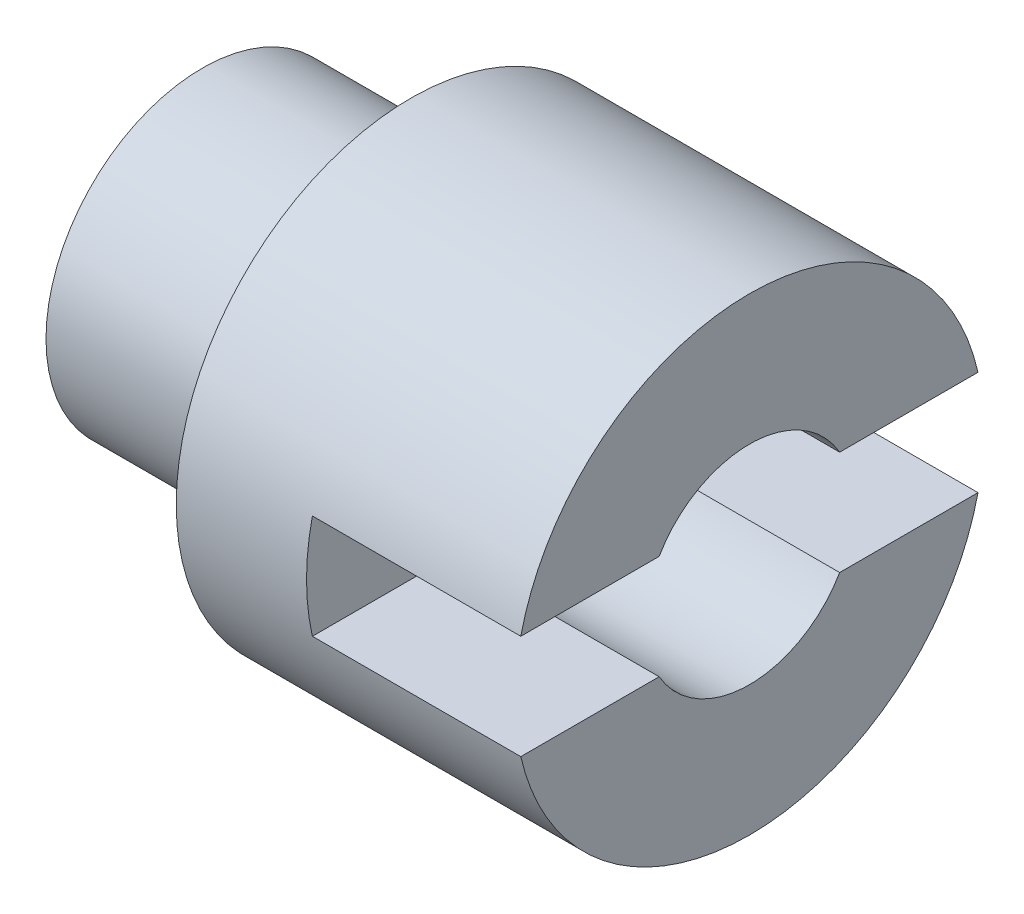
ISO-10303-21;
HEADER;
FILE_DESCRIPTION(('STEP AP214'),'2;1');
FILE_NAME('part.step','',(''),(''),'','','');
FILE_SCHEMA(('AUTOMOTIVE_DESIGN { 1 0 10303 214 1 1 1 1 }'));
ENDSEC;
DATA;
#1=APPLICATION_CONTEXT('core data for automotive mechanical design processes');
#2=APPLICATION_PROTOCOL_DEFINITION('international standard','automotive_design',2000,#1);
#3=PRODUCT_CONTEXT('',#1,'mechanical');
#4=PRODUCT('Part','Part','',(#3));
#5=PRODUCT_RELATED_PRODUCT_CATEGORY('part','',(#4));
#6=PRODUCT_DEFINITION_FORMATION('','',#4);
#7=PRODUCT_DEFINITION_CONTEXT('part definition',#1,'design');
#8=PRODUCT_DEFINITION('design','',#6,#7);
#9=PRODUCT_DEFINITION_SHAPE('','',#8);
#10=(LENGTH_UNIT() NAMED_UNIT(*) SI_UNIT(.MILLI.,.METRE.));
#11=(NAMED_UNIT(*) PLANE_ANGLE_UNIT() SI_UNIT($,.RADIAN.));
#12=(NAMED_UNIT(*) SI_UNIT($,.STERADIAN.) SOLID_ANGLE_UNIT());
#13=UNCERTAINTY_MEASURE_WITH_UNIT(LENGTH_MEASURE(1.E-05),#10,'distance_accuracy_value','');
#14=(GEOMETRIC_REPRESENTATION_CONTEXT(3) GLOBAL_UNCERTAINTY_ASSIGNED_CONTEXT((#13)) GLOBAL_UNIT_ASSIGNED_CONTEXT((#10,
#11,#12)) REPRESENTATION_CONTEXT('',''));
#15=CARTESIAN_POINT('',(0.,0.,0.));
#16=DIRECTION('',(0.,0.,1.));
#17=DIRECTION('',(1.,0.,0.));
#18=AXIS2_PLACEMENT_3D('',#15,#16,#17);
#19=CARTESIAN_POINT('',(0.,0.,0.));
#20=DIRECTION('',(-1.,0.,0.));
#21=DIRECTION('',(0.,0.,1.));
#22=AXIS2_PLACEMENT_3D('',#19,#20,#21);
#23=PLANE('',#22);
#24=CARTESIAN_POINT('',(0.,0.,0.));
#25=DIRECTION('',(-1.,0.,0.));
#26=DIRECTION('',(0.,0.,1.));
#27=AXIS2_PLACEMENT_3D('',#24,#25,#26);
#28=CIRCLE('',#27,0.98);
#29=CARTESIAN_POINT('',(0.,0.,0.98));
#30=VERTEX_POINT('',#29);
#31=EDGE_CURVE('E188',#30,#30,#28,.T.);
#32=ORIENTED_EDGE('',*,*,#31,.T.);
#33=EDGE_LOOP('',(#32));
#34=FACE_BOUND('',#33,.T.);
#35=DIRECTION('',(0.,0.,1.));
#36=VECTOR('',#35,1.);
#37=CARTESIAN_POINT('',(0.,1.,5.54444219318384));
#38=LINE('',#37,#36);
#39=CARTESIAN_POINT('',(0.,1.,1.73205080756888));
#40=VERTEX_POINT('',#39);
#41=CARTESIAN_POINT('',(0.,1.,4.38748219369606));
#42=VERTEX_POINT('',#41);
#43=EDGE_CURVE('E129',#40,#42,#38,.T.);
#44=ORIENTED_EDGE('',*,*,#43,.T.);
#45=CARTESIAN_POINT('',(0.,0.,0.));
#46=DIRECTION('',(-1.,0.,0.));
#47=DIRECTION('',(0.,0.,1.));
#48=AXIS2_PLACEMENT_3D('',#45,#46,#47);
#49=CIRCLE('',#48,4.5);
#50=CARTESIAN_POINT('',(0.,-1.,4.38748219369606));
#51=VERTEX_POINT('',#50);
#52=EDGE_CURVE('E134',#51,#42,#49,.T.);
#53=ORIENTED_EDGE('',*,*,#52,.F.);
#54=DIRECTION('',(0.,0.,-1.));
#55=VECTOR('',#54,1.);
#56=CARTESIAN_POINT('',(0.,-1.,5.54444219318384));
#57=LINE('',#56,#55);
#58=CARTESIAN_POINT('',(0.,-1.,1.73205080756888));
#59=VERTEX_POINT('',#58);
#60=EDGE_CURVE('E140',#51,#59,#57,.T.);
#61=ORIENTED_EDGE('',*,*,#60,.T.);
#62=CARTESIAN_POINT('',(0.,0.,0.));
#63=DIRECTION('',(1.,0.,0.));
#64=DIRECTION('',(0.,0.,-1.));
#65=AXIS2_PLACEMENT_3D('',#62,#63,#64);
#66=CIRCLE('',#65,2.);
#67=CARTESIAN_POINT('',(0.,-1.,-1.73205080756888));
#68=VERTEX_POINT('',#67);
#69=EDGE_CURVE('E149',#59,#68,#66,.T.);
#70=ORIENTED_EDGE('',*,*,#69,.T.);
#71=CARTESIAN_POINT('',(0.,-1.,-4.38748219369606));
#72=VERTEX_POINT('',#71);
#73=EDGE_CURVE('E137',#68,#72,#57,.T.);
#74=ORIENTED_EDGE('',*,*,#73,.T.);
#75=CARTESIAN_POINT('',(0.,1.,-4.38748219369606));
#76=VERTEX_POINT('',#75);
#77=EDGE_CURVE('E114',#76,#72,#49,.T.);
#78=ORIENTED_EDGE('',*,*,#77,.F.);
#79=CARTESIAN_POINT('',(0.,1.,-1.73205080756888));
#80=VERTEX_POINT('',#79);
#81=EDGE_CURVE('E55',#76,#80,#38,.T.);
#82=ORIENTED_EDGE('',*,*,#81,.T.);
#83=CARTESIAN_POINT('',(0.,0.,0.));
#84=DIRECTION('',(1.,0.,0.));
#85=DIRECTION('',(0.,0.,-1.));
#86=AXIS2_PLACEMENT_3D('',#83,#84,#85);
#87=CIRCLE('',#86,2.);
#88=EDGE_CURVE('E50',#80,#40,#87,.T.);
#89=ORIENTED_EDGE('',*,*,#88,.T.);
#90=EDGE_LOOP('',(#44,#53,#61,#70,#74,#78,#82,#89));
#91=FACE_BOUND('',#90,.T.);
#92=ADVANCED_FACE('F35',(#34,#91),#23,.F.);
#93=CARTESIAN_POINT('',(4.,0.,0.));
#94=DIRECTION('',(-1.,0.,0.));
#95=DIRECTION('',(0.,0.,1.));
#96=AXIS2_PLACEMENT_3D('',#93,#94,#95);
#97=CYLINDRICAL_SURFACE('',#96,2.);
#98=DIRECTION('',(-1.,0.,0.));
#99=VECTOR('',#98,1.);
#100=CARTESIAN_POINT('',(4.,-1.,1.73205080756888));
#101=LINE('',#100,#99);
#102=CARTESIAN_POINT('',(4.,-1.,1.73205080756888));
#103=VERTEX_POINT('',#102);
#104=EDGE_CURVE('E11',#103,#59,#101,.T.);
#105=ORIENTED_EDGE('',*,*,#104,.F.);
#106=CARTESIAN_POINT('',(4.,0.,0.));
#107=DIRECTION('',(1.,0.,0.));
#108=DIRECTION('',(0.,0.,-1.));
#109=AXIS2_PLACEMENT_3D('',#106,#107,#108);
#110=CIRCLE('',#109,2.);
#111=CARTESIAN_POINT('',(4.,-1.,-1.73205080756888));
#112=VERTEX_POINT('',#111);
#113=EDGE_CURVE('E150',#103,#112,#110,.T.);
#114=ORIENTED_EDGE('',*,*,#113,.T.);
#115=DIRECTION('',(-1.,0.,0.));
#116=VECTOR('',#115,1.);
#117=CARTESIAN_POINT('',(4.,-1.,-1.73205080756888));
#118=LINE('',#117,#116);
#119=EDGE_CURVE('E43',#68,#112,#118,.F.);
#120=ORIENTED_EDGE('',*,*,#119,.F.);
#121=ORIENTED_EDGE('',*,*,#69,.F.);
#122=EDGE_LOOP('',(#105,#114,#120,#121));
#123=FACE_BOUND('',#122,.T.);
#124=ADVANCED_FACE('F170',(#123),#97,.F.);
#125=CARTESIAN_POINT('',(4.,0.,0.));
#126=DIRECTION('',(-1.,0.,0.));
#127=DIRECTION('',(0.,0.,1.));
#128=AXIS2_PLACEMENT_3D('',#125,#126,#127);
#129=CYLINDRICAL_SURFACE('',#128,4.5);
#130=CARTESIAN_POINT('',(4.,0.,0.));
#131=DIRECTION('',(1.,0.,0.));
#132=DIRECTION('',(0.,0.,-1.));
#133=AXIS2_PLACEMENT_3D('',#130,#131,#132);
#134=CIRCLE('',#133,4.5);
#135=CARTESIAN_POINT('',(4.,-1.,4.38748219369606));
#136=VERTEX_POINT('',#135);
#137=CARTESIAN_POINT('',(4.,-1.,-4.38748219369606));
#138=VERTEX_POINT('',#137);
#139=EDGE_CURVE('E153',#136,#138,#134,.T.);
#140=ORIENTED_EDGE('',*,*,#139,.F.);
#141=DIRECTION('',(-1.,0.,0.));
#142=VECTOR('',#141,1.);
#143=CARTESIAN_POINT('',(4.,-1.,4.38748219369606));
#144=LINE('',#143,#142);
#145=EDGE_CURVE('E146',#136,#51,#144,.T.);
#146=ORIENTED_EDGE('',*,*,#145,.T.);
#147=ORIENTED_EDGE('',*,*,#52,.T.);
#148=DIRECTION('',(-1.,0.,0.));
#149=VECTOR('',#148,1.);
#150=CARTESIAN_POINT('',(4.,1.,4.38748219369606));
#151=LINE('',#150,#149);
#152=CARTESIAN_POINT('',(4.,1.,4.38748219369606));
#153=VERTEX_POINT('',#152);
#154=EDGE_CURVE('E119',#42,#153,#151,.F.);
#155=ORIENTED_EDGE('',*,*,#154,.T.);
#156=CARTESIAN_POINT('',(4.,0.,0.));
#157=DIRECTION('',(1.,0.,0.));
#158=DIRECTION('',(0.,0.,-1.));
#159=AXIS2_PLACEMENT_3D('',#156,#157,#158);
#160=CIRCLE('',#159,4.5);
#161=CARTESIAN_POINT('',(4.,1.,-4.38748219369606));
#162=VERTEX_POINT('',#161);
#163=EDGE_CURVE('E126',#162,#153,#160,.T.);
#164=ORIENTED_EDGE('',*,*,#163,.F.);
#165=DIRECTION('',(-1.,0.,0.));
#166=VECTOR('',#165,1.);
#167=CARTESIAN_POINT('',(4.,1.,-4.38748219369606));
#168=LINE('',#167,#166);
#169=EDGE_CURVE('E102',#162,#76,#168,.T.);
#170=ORIENTED_EDGE('',*,*,#169,.T.);
#171=ORIENTED_EDGE('',*,*,#77,.T.);
#172=DIRECTION('',(-1.,0.,0.));
#173=VECTOR('',#172,1.);
#174=CARTESIAN_POINT('',(4.,-1.,-4.38748219369606));
#175=LINE('',#174,#173);
#176=EDGE_CURVE('E143',#72,#138,#175,.F.);
#177=ORIENTED_EDGE('',*,*,#176,.T.);
#178=EDGE_LOOP('',(#140,#146,#147,#155,#164,#170,#171,#177));
#179=FACE_BOUND('',#178,.T.);
#180=CARTESIAN_POINT('',(-2.5,0.,0.));
#181=DIRECTION('',(-1.,0.,0.));
#182=DIRECTION('',(0.,0.,1.));
#183=AXIS2_PLACEMENT_3D('',#180,#181,#182);
#184=CIRCLE('',#183,4.5);
#185=CARTESIAN_POINT('',(-2.5,0.,4.5));
#186=VERTEX_POINT('',#185);
#187=EDGE_CURVE('E130',#186,#186,#184,.T.);
#188=ORIENTED_EDGE('',*,*,#187,.F.);
#189=EDGE_LOOP('',(#188));
#190=FACE_BOUND('',#189,.T.);
#191=ADVANCED_FACE('F37',(#179,#190),#129,.T.);
#192=CARTESIAN_POINT('',(4.,0.,0.));
#193=DIRECTION('',(1.,0.,0.));
#194=DIRECTION('',(0.,0.,-1.));
#195=AXIS2_PLACEMENT_3D('',#192,#193,#194);
#196=PLANE('',#195);
#197=DIRECTION('',(0.,0.,-1.));
#198=VECTOR('',#197,1.);
#199=CARTESIAN_POINT('',(4.,-1.,5.54444219318384));
#200=LINE('',#199,#198);
#201=EDGE_CURVE('E141',#136,#103,#200,.T.);
#202=ORIENTED_EDGE('',*,*,#201,.F.);
#203=ORIENTED_EDGE('',*,*,#139,.T.);
#204=EDGE_CURVE('E133',#112,#138,#200,.T.);
#205=ORIENTED_EDGE('',*,*,#204,.F.);
#206=ORIENTED_EDGE('',*,*,#113,.F.);
#207=EDGE_LOOP('',(#202,#203,#205,#206));
#208=FACE_BOUND('',#207,.T.);
#209=ADVANCED_FACE('F167',(#208),#196,.T.);
#210=CARTESIAN_POINT('',(0.,-1.,5.54444219318384));
#211=DIRECTION('',(0.,-1.,0.));
#212=DIRECTION('',(0.,0.,-1.));
#213=AXIS2_PLACEMENT_3D('',#210,#211,#212);
#214=PLANE('',#213);
#215=ORIENTED_EDGE('',*,*,#73,.F.);
#216=ORIENTED_EDGE('',*,*,#119,.T.);
#217=ORIENTED_EDGE('',*,*,#204,.T.);
#218=ORIENTED_EDGE('',*,*,#176,.F.);
#219=EDGE_LOOP('',(#215,#216,#217,#218));
#220=FACE_BOUND('',#219,.T.);
#221=ADVANCED_FACE('F160',(#220),#214,.F.);
#222=ORIENTED_EDGE('',*,*,#201,.T.);
#223=ORIENTED_EDGE('',*,*,#104,.T.);
#224=ORIENTED_EDGE('',*,*,#60,.F.);
#225=ORIENTED_EDGE('',*,*,#145,.F.);
#226=EDGE_LOOP('',(#222,#223,#224,#225));
#227=FACE_BOUND('',#226,.T.);
#228=ADVANCED_FACE('F173',(#227),#214,.F.);
#229=CARTESIAN_POINT('',(-2.5,0.,0.));
#230=DIRECTION('',(-1.,0.,0.));
#231=DIRECTION('',(0.,0.,1.));
#232=AXIS2_PLACEMENT_3D('',#229,#230,#231);
#233=PLANE('',#232);
#234=CARTESIAN_POINT('',(-2.5,0.,0.));
#235=DIRECTION('',(-1.,0.,0.));
#236=DIRECTION('',(0.,0.,1.));
#237=AXIS2_PLACEMENT_3D('',#234,#235,#236);
#238=CIRCLE('',#237,3.);
#239=CARTESIAN_POINT('',(-2.5,0.,3.));
#240=VERTEX_POINT('',#239);
#241=EDGE_CURVE('E183',#240,#240,#238,.T.);
#242=ORIENTED_EDGE('',*,*,#241,.F.);
#243=EDGE_LOOP('',(#242));
#244=FACE_BOUND('',#243,.T.);
#245=ORIENTED_EDGE('',*,*,#187,.T.);
#246=EDGE_LOOP('',(#245));
#247=FACE_BOUND('',#246,.T.);
#248=ADVANCED_FACE('F222',(#244,#247),#233,.T.);
#249=CARTESIAN_POINT('',(4.,0.,0.));
#250=DIRECTION('',(1.,0.,0.));
#251=DIRECTION('',(0.,0.,-1.));
#252=AXIS2_PLACEMENT_3D('',#249,#250,#251);
#253=PLANE('',#252);
#254=DIRECTION('',(0.,0.,1.));
#255=VECTOR('',#254,1.);
#256=CARTESIAN_POINT('',(4.,1.,5.54444219318384));
#257=LINE('',#256,#255);
#258=CARTESIAN_POINT('',(4.,1.,-1.73205080756888));
#259=VERTEX_POINT('',#258);
#260=EDGE_CURVE('E97',#162,#259,#257,.T.);
#261=ORIENTED_EDGE('',*,*,#260,.F.);
#262=ORIENTED_EDGE('',*,*,#163,.T.);
#263=CARTESIAN_POINT('',(4.,1.,1.73205080756888));
#264=VERTEX_POINT('',#263);
#265=EDGE_CURVE('E107',#264,#153,#257,.T.);
#266=ORIENTED_EDGE('',*,*,#265,.F.);
#267=CARTESIAN_POINT('',(4.,0.,0.));
#268=DIRECTION('',(1.,0.,0.));
#269=DIRECTION('',(0.,0.,-1.));
#270=AXIS2_PLACEMENT_3D('',#267,#268,#269);
#271=CIRCLE('',#270,2.);
#272=EDGE_CURVE('E113',#259,#264,#271,.T.);
#273=ORIENTED_EDGE('',*,*,#272,.F.);
#274=EDGE_LOOP('',(#261,#262,#266,#273));
#275=FACE_BOUND('',#274,.T.);
#276=ADVANCED_FACE('F117',(#275),#253,.T.);
#277=CARTESIAN_POINT('',(4.,0.,0.));
#278=DIRECTION('',(-1.,0.,0.));
#279=DIRECTION('',(0.,0.,1.));
#280=AXIS2_PLACEMENT_3D('',#277,#278,#279);
#281=CYLINDRICAL_SURFACE('',#280,2.);
#282=DIRECTION('',(-1.,0.,0.));
#283=VECTOR('',#282,1.);
#284=CARTESIAN_POINT('',(4.,1.,-1.73205080756888));
#285=LINE('',#284,#283);
#286=EDGE_CURVE('E100',#259,#80,#285,.T.);
#287=ORIENTED_EDGE('',*,*,#286,.F.);
#288=ORIENTED_EDGE('',*,*,#272,.T.);
#289=DIRECTION('',(-1.,0.,0.));
#290=VECTOR('',#289,1.);
#291=CARTESIAN_POINT('',(4.,1.,1.73205080756888));
#292=LINE('',#291,#290);
#293=EDGE_CURVE('E118',#40,#264,#292,.F.);
#294=ORIENTED_EDGE('',*,*,#293,.F.);
#295=ORIENTED_EDGE('',*,*,#88,.F.);
#296=EDGE_LOOP('',(#287,#288,#294,#295));
#297=FACE_BOUND('',#296,.T.);
#298=ADVANCED_FACE('F111',(#297),#281,.F.);
#299=CARTESIAN_POINT('',(0.,1.,5.54444219318384));
#300=DIRECTION('',(0.,1.,0.));
#301=DIRECTION('',(0.,0.,1.));
#302=AXIS2_PLACEMENT_3D('',#299,#300,#301);
#303=PLANE('',#302);
#304=ORIENTED_EDGE('',*,*,#43,.F.);
#305=ORIENTED_EDGE('',*,*,#293,.T.);
#306=ORIENTED_EDGE('',*,*,#265,.T.);
#307=ORIENTED_EDGE('',*,*,#154,.F.);
#308=EDGE_LOOP('',(#304,#305,#306,#307));
#309=FACE_BOUND('',#308,.T.);
#310=ADVANCED_FACE('F179',(#309),#303,.F.);
#311=ORIENTED_EDGE('',*,*,#260,.T.);
#312=ORIENTED_EDGE('',*,*,#286,.T.);
#313=ORIENTED_EDGE('',*,*,#81,.F.);
#314=ORIENTED_EDGE('',*,*,#169,.F.);
#315=EDGE_LOOP('',(#311,#312,#313,#314));
#316=FACE_BOUND('',#315,.T.);
#317=ADVANCED_FACE('F99',(#316),#303,.F.);
#318=CARTESIAN_POINT('',(-6.5,0.,0.));
#319=DIRECTION('',(1.,0.,0.));
#320=DIRECTION('',(0.,0.,-1.));
#321=AXIS2_PLACEMENT_3D('',#318,#319,#320);
#322=CYLINDRICAL_SURFACE('',#321,3.);
#323=CARTESIAN_POINT('',(-6.5,0.,0.));
#324=DIRECTION('',(-1.,0.,0.));
#325=DIRECTION('',(0.,0.,1.));
#326=AXIS2_PLACEMENT_3D('',#323,#324,#325);
#327=CIRCLE('',#326,3.);
#328=CARTESIAN_POINT('',(-6.5,0.,3.));
#329=VERTEX_POINT('',#328);
#330=EDGE_CURVE('E181',#329,#329,#327,.T.);
#331=ORIENTED_EDGE('',*,*,#330,.F.);
#332=EDGE_LOOP('',(#331));
#333=FACE_BOUND('',#332,.T.);
#334=ORIENTED_EDGE('',*,*,#241,.T.);
#335=EDGE_LOOP('',(#334));
#336=FACE_BOUND('',#335,.T.);
#337=ADVANCED_FACE('F202',(#333,#336),#322,.T.);
#338=CARTESIAN_POINT('',(-6.5,0.,0.));
#339=DIRECTION('',(-1.,0.,0.));
#340=DIRECTION('',(0.,0.,1.));
#341=AXIS2_PLACEMENT_3D('',#338,#339,#340);
#342=PLANE('',#341);
#343=CARTESIAN_POINT('',(-6.5,0.,0.));
#344=DIRECTION('',(-1.,0.,0.));
#345=DIRECTION('',(0.,0.,1.));
#346=AXIS2_PLACEMENT_3D('',#343,#344,#345);
#347=CIRCLE('',#346,0.98);
#348=CARTESIAN_POINT('',(-6.5,0.,0.98));
#349=VERTEX_POINT('',#348);
#350=EDGE_CURVE('E193',#349,#349,#347,.T.);
#351=ORIENTED_EDGE('',*,*,#350,.F.);
#352=EDGE_LOOP('',(#351));
#353=FACE_BOUND('',#352,.T.);
#354=ORIENTED_EDGE('',*,*,#330,.T.);
#355=EDGE_LOOP('',(#354));
#356=FACE_BOUND('',#355,.T.);
#357=ADVANCED_FACE('F200',(#353,#356),#342,.T.);
#358=CARTESIAN_POINT('',(4.,0.,0.));
#359=DIRECTION('',(-1.,0.,0.));
#360=DIRECTION('',(0.,0.,1.));
#361=AXIS2_PLACEMENT_3D('',#358,#359,#360);
#362=CYLINDRICAL_SURFACE('',#361,0.98);
#363=CARTESIAN_POINT('',(-6.5,0.,0.98));
#364=CARTESIAN_POINT('',(-6.43229166666667,0.,0.98));
#365=CARTESIAN_POINT('',(-6.36458333333333,0.,0.98));
#366=CARTESIAN_POINT('',(-6.22916666666667,0.,0.98));
#367=CARTESIAN_POINT('',(-6.16145833333333,0.,0.98));
#368=CARTESIAN_POINT('',(-6.02604166666667,0.,0.98));
#369=CARTESIAN_POINT('',(-5.95833333333333,0.,0.98));
#370=CARTESIAN_POINT('',(-5.82291666666667,0.,0.98));
#371=CARTESIAN_POINT('',(-5.75520833333333,0.,0.98));
#372=CARTESIAN_POINT('',(-5.61979166666667,0.,0.98));
#373=CARTESIAN_POINT('',(-5.55208333333333,0.,0.98));
#374=CARTESIAN_POINT('',(-5.41666666666667,0.,0.98));
#375=CARTESIAN_POINT('',(-5.34895833333333,0.,0.98));
#376=CARTESIAN_POINT('',(-5.21354166666667,0.,0.98));
#377=CARTESIAN_POINT('',(-5.14583333333333,0.,0.98));
#378=CARTESIAN_POINT('',(-5.01041666666667,0.,0.98));
#379=CARTESIAN_POINT('',(-4.94270833333333,0.,0.98));
#380=CARTESIAN_POINT('',(-4.80729166666667,0.,0.98));
#381=CARTESIAN_POINT('',(-4.73958333333333,0.,0.98));
#382=CARTESIAN_POINT('',(-4.60416666666667,0.,0.98));
#383=CARTESIAN_POINT('',(-4.53645833333333,0.,0.98));
#384=CARTESIAN_POINT('',(-4.40104166666667,0.,0.98));
#385=CARTESIAN_POINT('',(-4.33333333333333,0.,0.98));
#386=CARTESIAN_POINT('',(-4.19791666666667,0.,0.98));
#387=CARTESIAN_POINT('',(-4.13020833333333,0.,0.98));
#388=CARTESIAN_POINT('',(-3.99479166666667,0.,0.98));
#389=CARTESIAN_POINT('',(-3.92708333333333,0.,0.98));
#390=CARTESIAN_POINT('',(-3.79166666666667,0.,0.98));
#391=CARTESIAN_POINT('',(-3.72395833333333,0.,0.98));
#392=CARTESIAN_POINT('',(-3.58854166666667,0.,0.98));
#393=CARTESIAN_POINT('',(-3.52083333333333,0.,0.98));
#394=CARTESIAN_POINT('',(-3.38541666666667,0.,0.98));
#395=CARTESIAN_POINT('',(-3.31770833333333,0.,0.98));
#396=CARTESIAN_POINT('',(-3.18229166666667,0.,0.98));
#397=CARTESIAN_POINT('',(-3.11458333333333,0.,0.98));
#398=CARTESIAN_POINT('',(-2.97916666666667,0.,0.98));
#399=CARTESIAN_POINT('',(-2.91145833333333,0.,0.98));
#400=CARTESIAN_POINT('',(-2.77604166666667,0.,0.98));
#401=CARTESIAN_POINT('',(-2.70833333333333,0.,0.98));
#402=CARTESIAN_POINT('',(-2.57291666666667,0.,0.98));
#403=CARTESIAN_POINT('',(-2.50520833333333,0.,0.98));
#404=CARTESIAN_POINT('',(-2.36979166666667,0.,0.98));
#405=CARTESIAN_POINT('',(-2.30208333333333,0.,0.98));
#406=CARTESIAN_POINT('',(-2.16666666666667,0.,0.98));
#407=CARTESIAN_POINT('',(-2.09895833333333,0.,0.98));
#408=CARTESIAN_POINT('',(-1.96354166666667,0.,0.98));
#409=CARTESIAN_POINT('',(-1.89583333333333,0.,0.98));
#410=CARTESIAN_POINT('',(-1.76041666666667,0.,0.98));
#411=CARTESIAN_POINT('',(-1.69270833333333,0.,0.98));
#412=CARTESIAN_POINT('',(-1.55729166666667,0.,0.98));
#413=CARTESIAN_POINT('',(-1.48958333333333,0.,0.98));
#414=CARTESIAN_POINT('',(-1.35416666666667,0.,0.98));
#415=CARTESIAN_POINT('',(-1.28645833333333,0.,0.98));
#416=CARTESIAN_POINT('',(-1.15104166666667,0.,0.98));
#417=CARTESIAN_POINT('',(-1.08333333333333,0.,0.98));
#418=CARTESIAN_POINT('',(-0.947916666666666,0.,0.98));
#419=CARTESIAN_POINT('',(-0.880208333333333,0.,0.98));
#420=CARTESIAN_POINT('',(-0.744791666666667,0.,0.98));
#421=CARTESIAN_POINT('',(-0.677083333333333,0.,0.98));
#422=CARTESIAN_POINT('',(-0.541666666666666,0.,0.98));
#423=CARTESIAN_POINT('',(-0.473958333333333,0.,0.98));
#424=CARTESIAN_POINT('',(-0.338541666666666,0.,0.98));
#425=CARTESIAN_POINT('',(-0.270833333333333,0.,0.98));
#426=CARTESIAN_POINT('',(-0.135416666666666,0.,0.98));
#427=CARTESIAN_POINT('',(-0.0677083333333325,0.,0.98));
#428=CARTESIAN_POINT('',(0.,0.,0.98));
#429=B_SPLINE_CURVE_WITH_KNOTS('',3,(#363,#364,#365,#366,#367,#368,#369,#370,#371,#372,#373,
#374,#375,#376,#377,#378,#379,#380,#381,#382,#383,#384,#385,#386,#387,#388,#389,#390,#391,#392,
#393,#394,#395,#396,#397,#398,#399,#400,#401,#402,#403,#404,#405,#406,#407,#408,#409,#410,#411,
#412,#413,#414,#415,#416,#417,#418,#419,#420,#421,#422,#423,#424,#425,#426,#427,#428),
.UNSPECIFIED.,.F.,.F.,(4,2,2,2,2,2,2,2,2,2,2,2,2,2,2,2,2,2,2,2,2,2,2,2,2,2,2,2,2,2,2,2,4),(0.,
0.203125,0.40625,0.609375000000001,0.812500000000001,1.015625,1.21875,1.421875,1.625,1.828125,
2.03125,2.234375,2.4375,2.640625,2.84375,3.046875,3.25,3.453125,3.65625,3.859375,4.0625,
4.265625,4.46875,4.671875,4.875,5.078125,5.28125,5.484375,5.6875,5.890625,6.09375,6.296875,6.5),.UNSPECIFIED.);
#430=EDGE_CURVE('BSEAM197',#349,#30,#429,.T.);
#431=ORIENTED_EDGE('',*,*,#350,.T.);
#432=ORIENTED_EDGE('',*,*,#31,.F.);
#433=ORIENTED_EDGE('',*,*,#430,.T.);
#434=ORIENTED_EDGE('',*,*,#430,.F.);
#435=EDGE_LOOP('',(#431,#433,#432,#434));
#436=FACE_BOUND('',#435,.T.);
#437=ADVANCED_FACE('F197',(#436),#362,.F.);
#438=CLOSED_SHELL('',(#92,#124,#191,#209,#221,#228,#248,#276,#298,#310,#317,#337,#357,#437));
#439=MANIFOLD_SOLID_BREP('B2',#438);
#440=ADVANCED_BREP_SHAPE_REPRESENTATION('',(#18,#439),#14);
#441=SHAPE_DEFINITION_REPRESENTATION(#9,#440);
ENDSEC;
END-ISO-10303-21;
